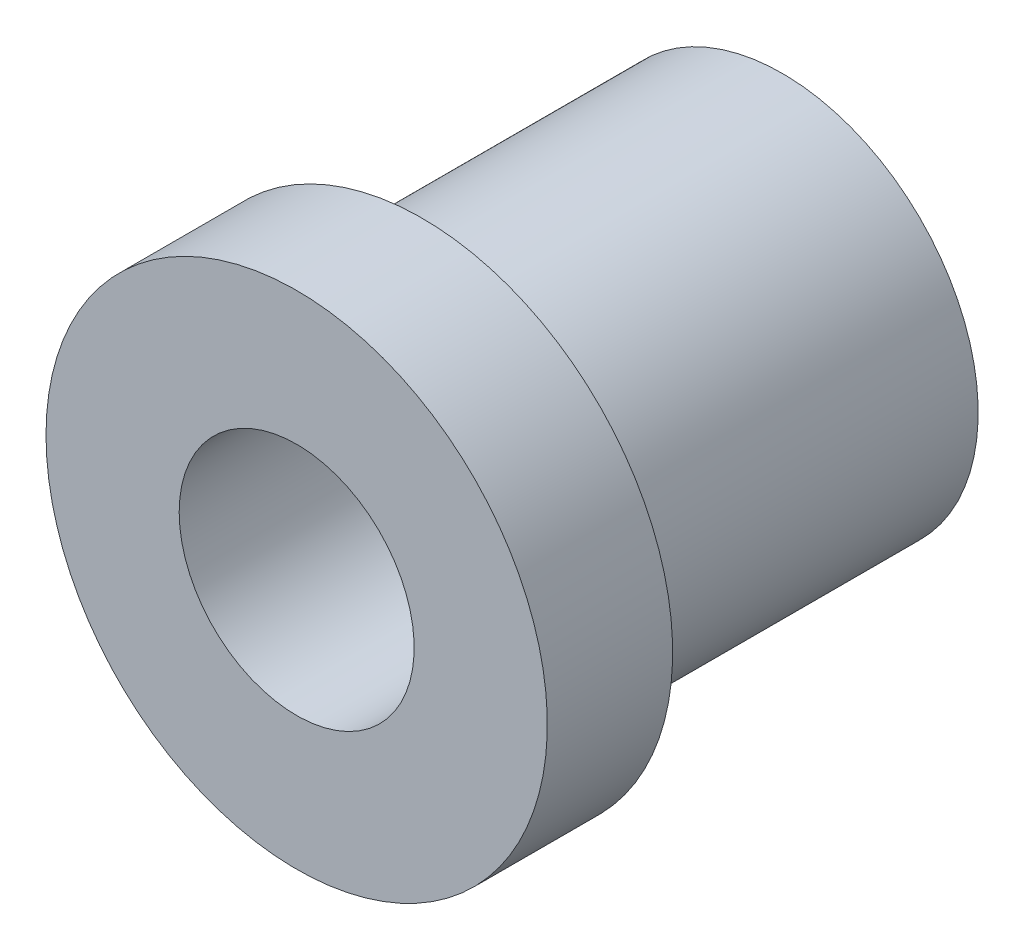
ISO-10303-21;
HEADER;
FILE_DESCRIPTION(('STEP AP214'),'2;1');
FILE_NAME('part.step','',(''),(''),'','','');
FILE_SCHEMA(('AUTOMOTIVE_DESIGN { 1 0 10303 214 1 1 1 1 }'));
ENDSEC;
DATA;
#1=APPLICATION_CONTEXT('core data for automotive mechanical design processes');
#2=APPLICATION_PROTOCOL_DEFINITION('international standard','automotive_design',2000,#1);
#3=PRODUCT_CONTEXT('',#1,'mechanical');
#4=PRODUCT('Part','Part','',(#3));
#5=PRODUCT_RELATED_PRODUCT_CATEGORY('part','',(#4));
#6=PRODUCT_DEFINITION_FORMATION('','',#4);
#7=PRODUCT_DEFINITION_CONTEXT('part definition',#1,'design');
#8=PRODUCT_DEFINITION('design','',#6,#7);
#9=PRODUCT_DEFINITION_SHAPE('','',#8);
#10=(LENGTH_UNIT() NAMED_UNIT(*) SI_UNIT(.MILLI.,.METRE.));
#11=(NAMED_UNIT(*) PLANE_ANGLE_UNIT() SI_UNIT($,.RADIAN.));
#12=(NAMED_UNIT(*) SI_UNIT($,.STERADIAN.) SOLID_ANGLE_UNIT());
#13=UNCERTAINTY_MEASURE_WITH_UNIT(LENGTH_MEASURE(1.E-05),#10,'distance_accuracy_value','');
#14=(GEOMETRIC_REPRESENTATION_CONTEXT(3) GLOBAL_UNCERTAINTY_ASSIGNED_CONTEXT((#13)) GLOBAL_UNIT_ASSIGNED_CONTEXT((#10,
#11,#12)) REPRESENTATION_CONTEXT('',''));
#15=CARTESIAN_POINT('',(0.,0.,0.));
#16=DIRECTION('',(0.,0.,1.));
#17=DIRECTION('',(1.,0.,0.));
#18=AXIS2_PLACEMENT_3D('',#15,#16,#17);
#19=CARTESIAN_POINT('',(0.,0.,-7.99615412292372));
#20=DIRECTION('',(0.,0.,1.));
#21=DIRECTION('',(1.,0.,0.));
#22=AXIS2_PLACEMENT_3D('',#19,#20,#21);
#23=PLANE('',#22);
#24=CARTESIAN_POINT('',(0.,0.,-7.99615412292372));
#25=DIRECTION('',(0.,0.,-1.));
#26=DIRECTION('',(-1.,0.,0.));
#27=AXIS2_PLACEMENT_3D('',#24,#25,#26);
#28=CIRCLE('',#27,12.5);
#29=CARTESIAN_POINT('',(-12.5,0.,-7.99615412292372));
#30=VERTEX_POINT('',#29);
#31=EDGE_CURVE('E56',#30,#30,#28,.T.);
#32=ORIENTED_EDGE('',*,*,#31,.F.);
#33=EDGE_LOOP('',(#32));
#34=FACE_BOUND('',#33,.T.);
#35=CARTESIAN_POINT('',(0.,0.,-7.99615412292372));
#36=DIRECTION('',(0.,0.,-1.));
#37=DIRECTION('',(-1.,0.,0.));
#38=AXIS2_PLACEMENT_3D('',#35,#36,#37);
#39=CIRCLE('',#38,16.);
#40=CARTESIAN_POINT('',(-16.,0.,-7.99615412292372));
#41=VERTEX_POINT('',#40);
#42=EDGE_CURVE('E10',#41,#41,#39,.T.);
#43=ORIENTED_EDGE('',*,*,#42,.T.);
#44=EDGE_LOOP('',(#43));
#45=FACE_BOUND('',#44,.T.);
#46=ADVANCED_FACE('F34',(#34,#45),#23,.F.);
#47=CARTESIAN_POINT('',(0.,0.,-31.8184261753771));
#48=DIRECTION('',(0.,0.,-1.));
#49=DIRECTION('',(-1.,0.,0.));
#50=AXIS2_PLACEMENT_3D('',#47,#48,#49);
#51=CYLINDRICAL_SURFACE('',#50,16.);
#52=ORIENTED_EDGE('',*,*,#42,.F.);
#53=EDGE_LOOP('',(#52));
#54=FACE_BOUND('',#53,.T.);
#55=CARTESIAN_POINT('',(0.,0.,0.00384587707628198));
#56=DIRECTION('',(0.,0.,-1.));
#57=DIRECTION('',(-1.,0.,0.));
#58=AXIS2_PLACEMENT_3D('',#55,#56,#57);
#59=CIRCLE('',#58,16.);
#60=CARTESIAN_POINT('',(-16.,0.,0.00384587707628198));
#61=VERTEX_POINT('',#60);
#62=EDGE_CURVE('E40',#61,#61,#59,.T.);
#63=ORIENTED_EDGE('',*,*,#62,.T.);
#64=EDGE_LOOP('',(#63));
#65=FACE_BOUND('',#64,.T.);
#66=ADVANCED_FACE('F63',(#54,#65),#51,.T.);
#67=CARTESIAN_POINT('',(0.,0.,0.00384587707628447));
#68=DIRECTION('',(0.,0.,-1.));
#69=DIRECTION('',(-1.,0.,0.));
#70=AXIS2_PLACEMENT_3D('',#67,#68,#69);
#71=PLANE('',#70);
#72=ORIENTED_EDGE('',*,*,#62,.F.);
#73=EDGE_LOOP('',(#72));
#74=FACE_BOUND('',#73,.T.);
#75=CARTESIAN_POINT('',(0.,0.,0.00384587707628198));
#76=DIRECTION('',(0.,0.,-1.));
#77=DIRECTION('',(-1.,0.,0.));
#78=AXIS2_PLACEMENT_3D('',#75,#76,#77);
#79=CIRCLE('',#78,7.5);
#80=CARTESIAN_POINT('',(-7.5,0.,0.00384587707628198));
#81=VERTEX_POINT('',#80);
#82=EDGE_CURVE('E44',#81,#81,#79,.T.);
#83=ORIENTED_EDGE('',*,*,#82,.T.);
#84=EDGE_LOOP('',(#83));
#85=FACE_BOUND('',#84,.T.);
#86=ADVANCED_FACE('F67',(#74,#85),#71,.F.);
#87=CARTESIAN_POINT('',(0.,0.,-31.8184261753771));
#88=DIRECTION('',(0.,0.,-1.));
#89=DIRECTION('',(-1.,0.,0.));
#90=AXIS2_PLACEMENT_3D('',#87,#88,#89);
#91=CYLINDRICAL_SURFACE('',#90,7.5);
#92=CARTESIAN_POINT('',(0.,0.,-30.9961541229237));
#93=DIRECTION('',(0.,0.,-1.));
#94=DIRECTION('',(-1.,0.,0.));
#95=AXIS2_PLACEMENT_3D('',#92,#93,#94);
#96=CIRCLE('',#95,7.5);
#97=CARTESIAN_POINT('',(-7.5,0.,-30.9961541229237));
#98=VERTEX_POINT('',#97);
#99=EDGE_CURVE('E48',#98,#98,#96,.T.);
#100=ORIENTED_EDGE('',*,*,#99,.T.);
#101=EDGE_LOOP('',(#100));
#102=FACE_BOUND('',#101,.T.);
#103=ORIENTED_EDGE('',*,*,#82,.F.);
#104=EDGE_LOOP('',(#103));
#105=FACE_BOUND('',#104,.T.);
#106=ADVANCED_FACE('F72',(#102,#105),#91,.F.);
#107=CARTESIAN_POINT('',(0.,0.,-30.9961541229237));
#108=DIRECTION('',(0.,0.,1.));
#109=DIRECTION('',(1.,0.,0.));
#110=AXIS2_PLACEMENT_3D('',#107,#108,#109);
#111=PLANE('',#110);
#112=ORIENTED_EDGE('',*,*,#99,.F.);
#113=EDGE_LOOP('',(#112));
#114=FACE_BOUND('',#113,.T.);
#115=CARTESIAN_POINT('',(0.,0.,-30.9961541229237));
#116=DIRECTION('',(0.,0.,-1.));
#117=DIRECTION('',(-1.,0.,0.));
#118=AXIS2_PLACEMENT_3D('',#115,#116,#117);
#119=CIRCLE('',#118,12.5);
#120=CARTESIAN_POINT('',(-12.5,0.,-30.9961541229237));
#121=VERTEX_POINT('',#120);
#122=EDGE_CURVE('E53',#121,#121,#119,.T.);
#123=ORIENTED_EDGE('',*,*,#122,.T.);
#124=EDGE_LOOP('',(#123));
#125=FACE_BOUND('',#124,.T.);
#126=ADVANCED_FACE('F78',(#114,#125),#111,.F.);
#127=CARTESIAN_POINT('',(0.,0.,-31.8184261753771));
#128=DIRECTION('',(0.,0.,-1.));
#129=DIRECTION('',(-1.,0.,0.));
#130=AXIS2_PLACEMENT_3D('',#127,#128,#129);
#131=CYLINDRICAL_SURFACE('',#130,12.5);
#132=ORIENTED_EDGE('',*,*,#122,.F.);
#133=EDGE_LOOP('',(#132));
#134=FACE_BOUND('',#133,.T.);
#135=ORIENTED_EDGE('',*,*,#31,.T.);
#136=EDGE_LOOP('',(#135));
#137=FACE_BOUND('',#136,.T.);
#138=ADVANCED_FACE('F60',(#134,#137),#131,.T.);
#139=CLOSED_SHELL('',(#46,#66,#86,#106,#126,#138));
#140=MANIFOLD_SOLID_BREP('B2',#139);
#141=ADVANCED_BREP_SHAPE_REPRESENTATION('',(#18,#140),#14);
#142=SHAPE_DEFINITION_REPRESENTATION(#9,#141);
ENDSEC;
END-ISO-10303-21;
